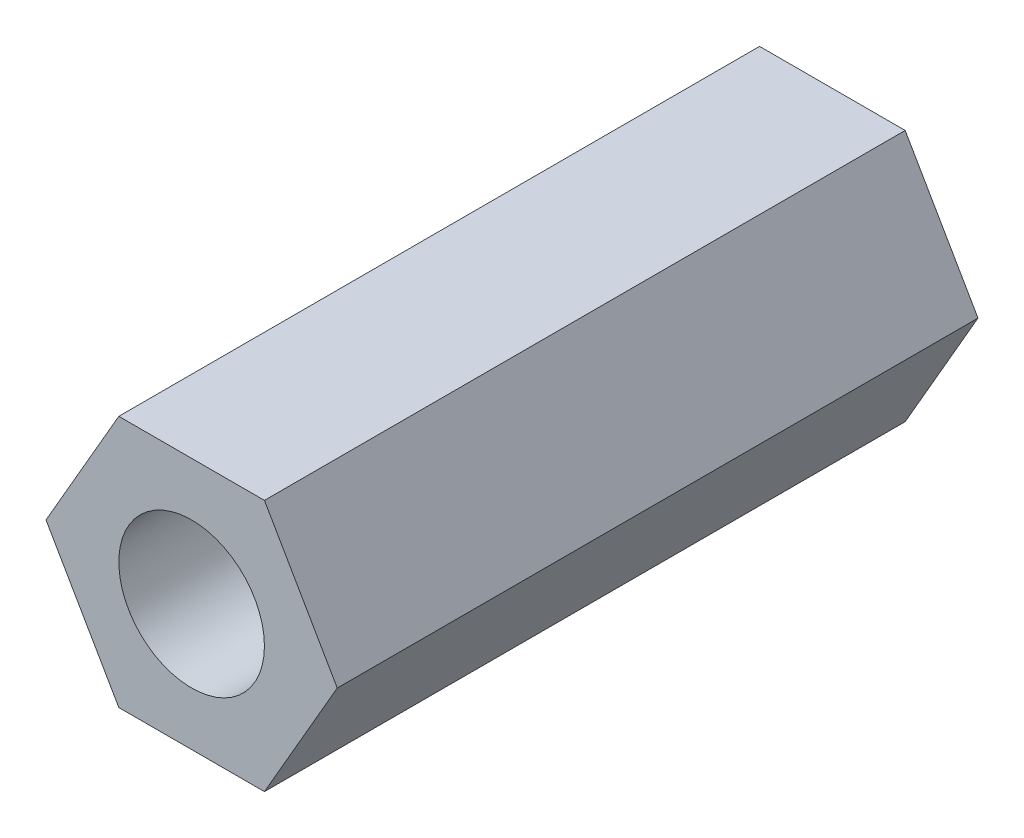
ISO-10303-21;
HEADER;
FILE_DESCRIPTION(('STEP AP214'),'2;1');
FILE_NAME('part.step','',(''),(''),'','','');
FILE_SCHEMA(('AUTOMOTIVE_DESIGN { 1 0 10303 214 1 1 1 1 }'));
ENDSEC;
DATA;
#1=APPLICATION_CONTEXT('core data for automotive mechanical design processes');
#2=APPLICATION_PROTOCOL_DEFINITION('international standard','automotive_design',2000,#1);
#3=PRODUCT_CONTEXT('',#1,'mechanical');
#4=PRODUCT('Part','Part','',(#3));
#5=PRODUCT_RELATED_PRODUCT_CATEGORY('part','',(#4));
#6=PRODUCT_DEFINITION_FORMATION('','',#4);
#7=PRODUCT_DEFINITION_CONTEXT('part definition',#1,'design');
#8=PRODUCT_DEFINITION('design','',#6,#7);
#9=PRODUCT_DEFINITION_SHAPE('','',#8);
#10=(LENGTH_UNIT() NAMED_UNIT(*) SI_UNIT(.MILLI.,.METRE.));
#11=(NAMED_UNIT(*) PLANE_ANGLE_UNIT() SI_UNIT($,.RADIAN.));
#12=(NAMED_UNIT(*) SI_UNIT($,.STERADIAN.) SOLID_ANGLE_UNIT());
#13=UNCERTAINTY_MEASURE_WITH_UNIT(LENGTH_MEASURE(1.E-05),#10,'distance_accuracy_value','');
#14=(GEOMETRIC_REPRESENTATION_CONTEXT(3) GLOBAL_UNCERTAINTY_ASSIGNED_CONTEXT((#13)) GLOBAL_UNIT_ASSIGNED_CONTEXT((#10,
#11,#12)) REPRESENTATION_CONTEXT('',''));
#15=CARTESIAN_POINT('',(0.,0.,0.));
#16=DIRECTION('',(0.,0.,1.));
#17=DIRECTION('',(1.,0.,0.));
#18=AXIS2_PLACEMENT_3D('',#15,#16,#17);
#19=CARTESIAN_POINT('',(-1.25,-2.1650635094611,11.));
#20=DIRECTION('',(0.866025403784439,-0.5,0.));
#21=DIRECTION('',(0.5,0.866025403784439,0.));
#22=AXIS2_PLACEMENT_3D('',#19,#20,#21);
#23=PLANE('',#22);
#24=DIRECTION('',(-0.5,-0.866025403784439,0.));
#25=VECTOR('',#24,1.);
#26=CARTESIAN_POINT('',(-1.25,-2.1650635094611,0.));
#27=LINE('',#26,#25);
#28=CARTESIAN_POINT('',(0.,0.,0.));
#29=VERTEX_POINT('',#28);
#30=CARTESIAN_POINT('',(-1.25,-2.1650635094611,0.));
#31=VERTEX_POINT('',#30);
#32=EDGE_CURVE('E130',#29,#31,#27,.T.);
#33=ORIENTED_EDGE('',*,*,#32,.T.);
#34=DIRECTION('',(0.,0.,-1.));
#35=VECTOR('',#34,1.);
#36=CARTESIAN_POINT('',(-1.25,-2.1650635094611,11.));
#37=LINE('',#36,#35);
#38=CARTESIAN_POINT('',(-1.25,-2.1650635094611,11.));
#39=VERTEX_POINT('',#38);
#40=EDGE_CURVE('E11',#39,#31,#37,.T.);
#41=ORIENTED_EDGE('',*,*,#40,.F.);
#42=DIRECTION('',(-0.5,-0.866025403784439,0.));
#43=VECTOR('',#42,1.);
#44=CARTESIAN_POINT('',(-1.25,-2.1650635094611,11.));
#45=LINE('',#44,#43);
#46=CARTESIAN_POINT('',(0.,0.,11.));
#47=VERTEX_POINT('',#46);
#48=EDGE_CURVE('E147',#47,#39,#45,.T.);
#49=ORIENTED_EDGE('',*,*,#48,.F.);
#50=DIRECTION('',(0.,0.,-1.));
#51=VECTOR('',#50,1.);
#52=CARTESIAN_POINT('',(0.,0.,11.));
#53=LINE('',#52,#51);
#54=EDGE_CURVE('E126',#47,#29,#53,.T.);
#55=ORIENTED_EDGE('',*,*,#54,.T.);
#56=EDGE_LOOP('',(#33,#41,#49,#55));
#57=FACE_BOUND('',#56,.T.);
#58=ADVANCED_FACE('F41',(#57),#23,.F.);
#59=CARTESIAN_POINT('',(0.,-4.33012701892219,11.));
#60=DIRECTION('',(0.866025403784439,0.5,0.));
#61=DIRECTION('',(-0.5,0.866025403784439,0.));
#62=AXIS2_PLACEMENT_3D('',#59,#60,#61);
#63=PLANE('',#62);
#64=DIRECTION('',(0.5,-0.866025403784439,0.));
#65=VECTOR('',#64,1.);
#66=CARTESIAN_POINT('',(0.,-4.33012701892219,0.));
#67=LINE('',#66,#65);
#68=CARTESIAN_POINT('',(0.,-4.33012701892219,0.));
#69=VERTEX_POINT('',#68);
#70=EDGE_CURVE('E134',#31,#69,#67,.T.);
#71=ORIENTED_EDGE('',*,*,#70,.T.);
#72=DIRECTION('',(0.,0.,-1.));
#73=VECTOR('',#72,1.);
#74=CARTESIAN_POINT('',(0.,-4.33012701892219,11.));
#75=LINE('',#74,#73);
#76=CARTESIAN_POINT('',(0.,-4.33012701892219,11.));
#77=VERTEX_POINT('',#76);
#78=EDGE_CURVE('E50',#77,#69,#75,.T.);
#79=ORIENTED_EDGE('',*,*,#78,.F.);
#80=DIRECTION('',(0.5,-0.866025403784439,0.));
#81=VECTOR('',#80,1.);
#82=CARTESIAN_POINT('',(0.,-4.33012701892219,11.));
#83=LINE('',#82,#81);
#84=EDGE_CURVE('E95',#39,#77,#83,.T.);
#85=ORIENTED_EDGE('',*,*,#84,.F.);
#86=ORIENTED_EDGE('',*,*,#40,.T.);
#87=EDGE_LOOP('',(#71,#79,#85,#86));
#88=FACE_BOUND('',#87,.T.);
#89=ADVANCED_FACE('F176',(#88),#63,.F.);
#90=CARTESIAN_POINT('',(2.5,-4.33012701892219,11.));
#91=DIRECTION('',(0.,1.,0.));
#92=DIRECTION('',(0.,0.,1.));
#93=AXIS2_PLACEMENT_3D('',#90,#91,#92);
#94=PLANE('',#93);
#95=DIRECTION('',(1.,0.,0.));
#96=VECTOR('',#95,1.);
#97=CARTESIAN_POINT('',(2.5,-4.33012701892219,0.));
#98=LINE('',#97,#96);
#99=CARTESIAN_POINT('',(2.5,-4.33012701892219,0.));
#100=VERTEX_POINT('',#99);
#101=EDGE_CURVE('E138',#69,#100,#98,.T.);
#102=ORIENTED_EDGE('',*,*,#101,.T.);
#103=DIRECTION('',(0.,0.,-1.));
#104=VECTOR('',#103,1.);
#105=CARTESIAN_POINT('',(2.5,-4.33012701892219,11.));
#106=LINE('',#105,#104);
#107=CARTESIAN_POINT('',(2.5,-4.33012701892219,11.));
#108=VERTEX_POINT('',#107);
#109=EDGE_CURVE('E119',#108,#100,#106,.T.);
#110=ORIENTED_EDGE('',*,*,#109,.F.);
#111=DIRECTION('',(1.,0.,0.));
#112=VECTOR('',#111,1.);
#113=CARTESIAN_POINT('',(2.5,-4.33012701892219,11.));
#114=LINE('',#113,#112);
#115=EDGE_CURVE('E108',#77,#108,#114,.T.);
#116=ORIENTED_EDGE('',*,*,#115,.F.);
#117=ORIENTED_EDGE('',*,*,#78,.T.);
#118=EDGE_LOOP('',(#102,#110,#116,#117));
#119=FACE_BOUND('',#118,.T.);
#120=ADVANCED_FACE('F157',(#119),#94,.F.);
#121=CARTESIAN_POINT('',(3.75,-2.1650635094611,11.));
#122=DIRECTION('',(-0.866025403784439,0.5,0.));
#123=DIRECTION('',(-0.5,-0.866025403784439,0.));
#124=AXIS2_PLACEMENT_3D('',#121,#122,#123);
#125=PLANE('',#124);
#126=DIRECTION('',(0.5,0.866025403784439,0.));
#127=VECTOR('',#126,1.);
#128=CARTESIAN_POINT('',(3.75,-2.1650635094611,0.));
#129=LINE('',#128,#127);
#130=CARTESIAN_POINT('',(3.75,-2.1650635094611,0.));
#131=VERTEX_POINT('',#130);
#132=EDGE_CURVE('E117',#100,#131,#129,.T.);
#133=ORIENTED_EDGE('',*,*,#132,.T.);
#134=DIRECTION('',(0.,0.,-1.));
#135=VECTOR('',#134,1.);
#136=CARTESIAN_POINT('',(3.75,-2.1650635094611,11.));
#137=LINE('',#136,#135);
#138=CARTESIAN_POINT('',(3.75,-2.1650635094611,11.));
#139=VERTEX_POINT('',#138);
#140=EDGE_CURVE('E114',#139,#131,#137,.T.);
#141=ORIENTED_EDGE('',*,*,#140,.F.);
#142=DIRECTION('',(0.5,0.866025403784439,0.));
#143=VECTOR('',#142,1.);
#144=CARTESIAN_POINT('',(3.75,-2.1650635094611,11.));
#145=LINE('',#144,#143);
#146=EDGE_CURVE('E102',#108,#139,#145,.T.);
#147=ORIENTED_EDGE('',*,*,#146,.F.);
#148=ORIENTED_EDGE('',*,*,#109,.T.);
#149=EDGE_LOOP('',(#133,#141,#147,#148));
#150=FACE_BOUND('',#149,.T.);
#151=ADVANCED_FACE('F115',(#150),#125,.F.);
#152=CARTESIAN_POINT('',(2.5,0.,11.));
#153=DIRECTION('',(-0.866025403784439,-0.5,0.));
#154=DIRECTION('',(0.5,-0.866025403784439,0.));
#155=AXIS2_PLACEMENT_3D('',#152,#153,#154);
#156=PLANE('',#155);
#157=DIRECTION('',(-0.5,0.866025403784439,0.));
#158=VECTOR('',#157,1.);
#159=CARTESIAN_POINT('',(2.5,0.,0.));
#160=LINE('',#159,#158);
#161=CARTESIAN_POINT('',(2.5,0.,0.));
#162=VERTEX_POINT('',#161);
#163=EDGE_CURVE('E81',#131,#162,#160,.T.);
#164=ORIENTED_EDGE('',*,*,#163,.T.);
#165=DIRECTION('',(0.,0.,-1.));
#166=VECTOR('',#165,1.);
#167=CARTESIAN_POINT('',(2.5,0.,11.));
#168=LINE('',#167,#166);
#169=CARTESIAN_POINT('',(2.5,0.,11.));
#170=VERTEX_POINT('',#169);
#171=EDGE_CURVE('E120',#170,#162,#168,.T.);
#172=ORIENTED_EDGE('',*,*,#171,.F.);
#173=DIRECTION('',(-0.5,0.866025403784439,0.));
#174=VECTOR('',#173,1.);
#175=CARTESIAN_POINT('',(2.5,0.,11.));
#176=LINE('',#175,#174);
#177=EDGE_CURVE('E106',#139,#170,#176,.T.);
#178=ORIENTED_EDGE('',*,*,#177,.F.);
#179=ORIENTED_EDGE('',*,*,#140,.T.);
#180=EDGE_LOOP('',(#164,#172,#178,#179));
#181=FACE_BOUND('',#180,.T.);
#182=ADVANCED_FACE('F122',(#181),#156,.F.);
#183=CARTESIAN_POINT('',(0.,0.,11.));
#184=DIRECTION('',(0.,-1.,0.));
#185=DIRECTION('',(0.,0.,-1.));
#186=AXIS2_PLACEMENT_3D('',#183,#184,#185);
#187=PLANE('',#186);
#188=DIRECTION('',(-1.,0.,0.));
#189=VECTOR('',#188,1.);
#190=CARTESIAN_POINT('',(0.,0.,0.));
#191=LINE('',#190,#189);
#192=EDGE_CURVE('E87',#162,#29,#191,.T.);
#193=ORIENTED_EDGE('',*,*,#192,.T.);
#194=ORIENTED_EDGE('',*,*,#54,.F.);
#195=DIRECTION('',(-1.,0.,0.));
#196=VECTOR('',#195,1.);
#197=CARTESIAN_POINT('',(0.,0.,11.));
#198=LINE('',#197,#196);
#199=EDGE_CURVE('E58',#170,#47,#198,.T.);
#200=ORIENTED_EDGE('',*,*,#199,.F.);
#201=ORIENTED_EDGE('',*,*,#171,.T.);
#202=EDGE_LOOP('',(#193,#194,#200,#201));
#203=FACE_BOUND('',#202,.T.);
#204=ADVANCED_FACE('F164',(#203),#187,.F.);
#205=CARTESIAN_POINT('',(0.,0.,11.));
#206=DIRECTION('',(0.,0.,-1.));
#207=DIRECTION('',(-1.,0.,0.));
#208=AXIS2_PLACEMENT_3D('',#205,#206,#207);
#209=PLANE('',#208);
#210=CARTESIAN_POINT('',(1.25,-2.1650635094611,11.));
#211=DIRECTION('',(0.,0.,1.));
#212=DIRECTION('',(1.,0.,0.));
#213=AXIS2_PLACEMENT_3D('',#210,#211,#212);
#214=CIRCLE('',#213,1.24999999999999);
#215=CARTESIAN_POINT('',(2.49999999999999,-2.1650635094611,11.));
#216=VERTEX_POINT('',#215);
#217=EDGE_CURVE('E233',#216,#216,#214,.T.);
#218=ORIENTED_EDGE('',*,*,#217,.F.);
#219=EDGE_LOOP('',(#218));
#220=FACE_BOUND('',#219,.T.);
#221=ORIENTED_EDGE('',*,*,#48,.T.);
#222=ORIENTED_EDGE('',*,*,#84,.T.);
#223=ORIENTED_EDGE('',*,*,#115,.T.);
#224=ORIENTED_EDGE('',*,*,#146,.T.);
#225=ORIENTED_EDGE('',*,*,#177,.T.);
#226=ORIENTED_EDGE('',*,*,#199,.T.);
#227=EDGE_LOOP('',(#221,#222,#223,#224,#225,#226));
#228=FACE_BOUND('',#227,.T.);
#229=ADVANCED_FACE('F104',(#220,#228),#209,.F.);
#230=CARTESIAN_POINT('',(0.,0.,0.));
#231=DIRECTION('',(0.,0.,-1.));
#232=DIRECTION('',(-1.,0.,0.));
#233=AXIS2_PLACEMENT_3D('',#230,#231,#232);
#234=PLANE('',#233);
#235=CARTESIAN_POINT('',(1.25,-2.1650635094611,0.));
#236=DIRECTION('',(0.,0.,1.));
#237=DIRECTION('',(1.,0.,0.));
#238=AXIS2_PLACEMENT_3D('',#235,#236,#237);
#239=CIRCLE('',#238,1.25);
#240=CARTESIAN_POINT('',(2.5,-2.1650635094611,0.));
#241=VERTEX_POINT('',#240);
#242=EDGE_CURVE('E135',#241,#241,#239,.T.);
#243=ORIENTED_EDGE('',*,*,#242,.T.);
#244=EDGE_LOOP('',(#243));
#245=FACE_BOUND('',#244,.T.);
#246=ORIENTED_EDGE('',*,*,#32,.F.);
#247=ORIENTED_EDGE('',*,*,#192,.F.);
#248=ORIENTED_EDGE('',*,*,#163,.F.);
#249=ORIENTED_EDGE('',*,*,#132,.F.);
#250=ORIENTED_EDGE('',*,*,#101,.F.);
#251=ORIENTED_EDGE('',*,*,#70,.F.);
#252=EDGE_LOOP('',(#246,#247,#248,#249,#250,#251));
#253=FACE_BOUND('',#252,.T.);
#254=ADVANCED_FACE('F160',(#245,#253),#234,.T.);
#255=CARTESIAN_POINT('',(1.25,-2.1650635094611,11.));
#256=DIRECTION('',(0.,0.,1.));
#257=DIRECTION('',(1.,0.,0.));
#258=AXIS2_PLACEMENT_3D('',#255,#256,#257);
#259=CYLINDRICAL_SURFACE('',#258,1.24999999999999);
#260=ORIENTED_EDGE('',*,*,#242,.F.);
#261=EDGE_LOOP('',(#260));
#262=FACE_BOUND('',#261,.T.);
#263=ORIENTED_EDGE('',*,*,#217,.T.);
#264=EDGE_LOOP('',(#263));
#265=FACE_BOUND('',#264,.T.);
#266=ADVANCED_FACE('F213',(#262,#265),#259,.F.);
#267=CLOSED_SHELL('',(#58,#89,#120,#151,#182,#204,#229,#254,#266));
#268=MANIFOLD_SOLID_BREP('B2',#267);
#269=ADVANCED_BREP_SHAPE_REPRESENTATION('',(#18,#268),#14);
#270=SHAPE_DEFINITION_REPRESENTATION(#9,#269);
ENDSEC;
END-ISO-10303-21;
